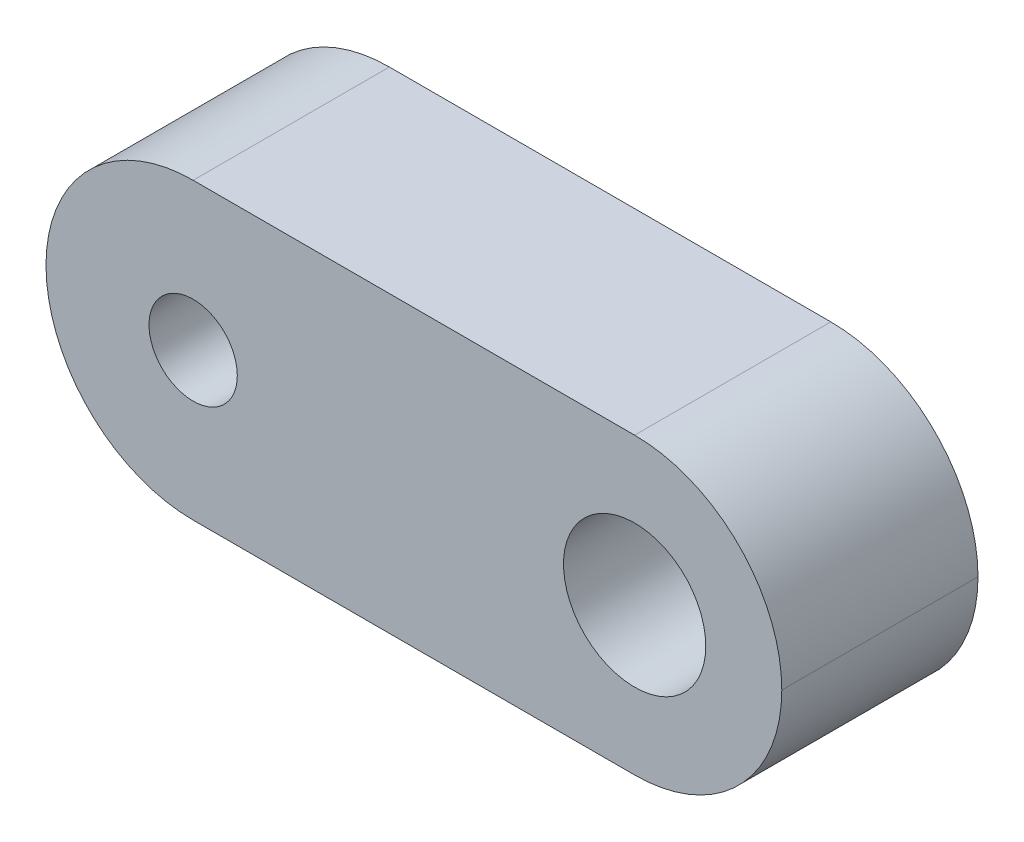
ISO-10303-21;
HEADER;
FILE_DESCRIPTION(('STEP AP214'),'2;1');
FILE_NAME('part.step','',(''),(''),'','','');
FILE_SCHEMA(('AUTOMOTIVE_DESIGN { 1 0 10303 214 1 1 1 1 }'));
ENDSEC;
DATA;
#1=APPLICATION_CONTEXT('core data for automotive mechanical design processes');
#2=APPLICATION_PROTOCOL_DEFINITION('international standard','automotive_design',2000,#1);
#3=PRODUCT_CONTEXT('',#1,'mechanical');
#4=PRODUCT('Part','Part','',(#3));
#5=PRODUCT_RELATED_PRODUCT_CATEGORY('part','',(#4));
#6=PRODUCT_DEFINITION_FORMATION('','',#4);
#7=PRODUCT_DEFINITION_CONTEXT('part definition',#1,'design');
#8=PRODUCT_DEFINITION('design','',#6,#7);
#9=PRODUCT_DEFINITION_SHAPE('','',#8);
#10=(LENGTH_UNIT() NAMED_UNIT(*) SI_UNIT(.MILLI.,.METRE.));
#11=(NAMED_UNIT(*) PLANE_ANGLE_UNIT() SI_UNIT($,.RADIAN.));
#12=(NAMED_UNIT(*) SI_UNIT($,.STERADIAN.) SOLID_ANGLE_UNIT());
#13=UNCERTAINTY_MEASURE_WITH_UNIT(LENGTH_MEASURE(1.E-05),#10,'distance_accuracy_value','');
#14=(GEOMETRIC_REPRESENTATION_CONTEXT(3) GLOBAL_UNCERTAINTY_ASSIGNED_CONTEXT((#13)) GLOBAL_UNIT_ASSIGNED_CONTEXT((#10,
#11,#12)) REPRESENTATION_CONTEXT('',''));
#15=CARTESIAN_POINT('',(0.,0.,0.));
#16=DIRECTION('',(0.,0.,1.));
#17=DIRECTION('',(1.,0.,0.));
#18=AXIS2_PLACEMENT_3D('',#15,#16,#17);
#19=CARTESIAN_POINT('',(0.,-6.,4.));
#20=DIRECTION('',(0.,1.,0.));
#21=DIRECTION('',(0.,0.,1.));
#22=AXIS2_PLACEMENT_3D('',#19,#20,#21);
#23=PLANE('',#22);
#24=DIRECTION('',(1.,0.,0.));
#25=VECTOR('',#24,1.);
#26=CARTESIAN_POINT('',(0.,-6.,0.));
#27=LINE('',#26,#25);
#28=CARTESIAN_POINT('',(3.,-6.,0.));
#29=VERTEX_POINT('',#28);
#30=CARTESIAN_POINT('',(12.,-6.,0.));
#31=VERTEX_POINT('',#30);
#32=EDGE_CURVE('E103',#29,#31,#27,.T.);
#33=ORIENTED_EDGE('',*,*,#32,.T.);
#34=DIRECTION('',(0.,0.,-1.));
#35=VECTOR('',#34,1.);
#36=CARTESIAN_POINT('',(12.,-6.,4.));
#37=LINE('',#36,#35);
#38=CARTESIAN_POINT('',(12.,-6.,4.));
#39=VERTEX_POINT('',#38);
#40=EDGE_CURVE('E135',#31,#39,#37,.F.);
#41=ORIENTED_EDGE('',*,*,#40,.T.);
#42=DIRECTION('',(1.,0.,0.));
#43=VECTOR('',#42,1.);
#44=CARTESIAN_POINT('',(0.,-6.,4.));
#45=LINE('',#44,#43);
#46=CARTESIAN_POINT('',(3.,-6.,4.));
#47=VERTEX_POINT('',#46);
#48=EDGE_CURVE('E145',#47,#39,#45,.T.);
#49=ORIENTED_EDGE('',*,*,#48,.F.);
#50=DIRECTION('',(0.,0.,-1.));
#51=VECTOR('',#50,1.);
#52=CARTESIAN_POINT('',(3.,-6.,4.));
#53=LINE('',#52,#51);
#54=EDGE_CURVE('E138',#47,#29,#53,.T.);
#55=ORIENTED_EDGE('',*,*,#54,.T.);
#56=EDGE_LOOP('',(#33,#41,#49,#55));
#57=FACE_BOUND('',#56,.T.);
#58=ADVANCED_FACE('F44',(#57),#23,.F.);
#59=CARTESIAN_POINT('',(0.,0.,4.));
#60=DIRECTION('',(0.,-1.,0.));
#61=DIRECTION('',(0.,0.,-1.));
#62=AXIS2_PLACEMENT_3D('',#59,#60,#61);
#63=PLANE('',#62);
#64=DIRECTION('',(-1.,0.,0.));
#65=VECTOR('',#64,1.);
#66=CARTESIAN_POINT('',(0.,0.,4.));
#67=LINE('',#66,#65);
#68=CARTESIAN_POINT('',(12.,0.,4.));
#69=VERTEX_POINT('',#68);
#70=CARTESIAN_POINT('',(3.,0.,4.));
#71=VERTEX_POINT('',#70);
#72=EDGE_CURVE('E114',#69,#71,#67,.T.);
#73=ORIENTED_EDGE('',*,*,#72,.F.);
#74=DIRECTION('',(0.,0.,-1.));
#75=VECTOR('',#74,1.);
#76=CARTESIAN_POINT('',(12.,0.,4.));
#77=LINE('',#76,#75);
#78=CARTESIAN_POINT('',(12.,0.,0.));
#79=VERTEX_POINT('',#78);
#80=EDGE_CURVE('E13',#69,#79,#77,.T.);
#81=ORIENTED_EDGE('',*,*,#80,.T.);
#82=DIRECTION('',(-1.,0.,0.));
#83=VECTOR('',#82,1.);
#84=CARTESIAN_POINT('',(0.,0.,0.));
#85=LINE('',#84,#83);
#86=CARTESIAN_POINT('',(3.,0.,0.));
#87=VERTEX_POINT('',#86);
#88=EDGE_CURVE('E143',#79,#87,#85,.T.);
#89=ORIENTED_EDGE('',*,*,#88,.T.);
#90=DIRECTION('',(0.,0.,-1.));
#91=VECTOR('',#90,1.);
#92=CARTESIAN_POINT('',(3.,0.,4.));
#93=LINE('',#92,#91);
#94=EDGE_CURVE('E53',#87,#71,#93,.F.);
#95=ORIENTED_EDGE('',*,*,#94,.T.);
#96=EDGE_LOOP('',(#73,#81,#89,#95));
#97=FACE_BOUND('',#96,.T.);
#98=ADVANCED_FACE('F165',(#97),#63,.F.);
#99=CARTESIAN_POINT('',(0.,0.,4.));
#100=DIRECTION('',(0.,0.,1.));
#101=DIRECTION('',(1.,0.,0.));
#102=AXIS2_PLACEMENT_3D('',#99,#100,#101);
#103=PLANE('',#102);
#104=CARTESIAN_POINT('',(12.,-3.,4.));
#105=DIRECTION('',(0.,0.,1.));
#106=DIRECTION('',(1.,0.,0.));
#107=AXIS2_PLACEMENT_3D('',#104,#105,#106);
#108=CIRCLE('',#107,1.45);
#109=CARTESIAN_POINT('',(13.45,-3.,4.));
#110=VERTEX_POINT('',#109);
#111=EDGE_CURVE('E125',#110,#110,#108,.T.);
#112=ORIENTED_EDGE('',*,*,#111,.F.);
#113=EDGE_LOOP('',(#112));
#114=FACE_BOUND('',#113,.T.);
#115=CARTESIAN_POINT('',(3.,-3.,4.));
#116=DIRECTION('',(0.,0.,1.));
#117=DIRECTION('',(1.,0.,0.));
#118=AXIS2_PLACEMENT_3D('',#115,#116,#117);
#119=CIRCLE('',#118,0.9);
#120=CARTESIAN_POINT('',(3.9,-3.,4.));
#121=VERTEX_POINT('',#120);
#122=EDGE_CURVE('E147',#121,#121,#119,.T.);
#123=ORIENTED_EDGE('',*,*,#122,.F.);
#124=EDGE_LOOP('',(#123));
#125=FACE_BOUND('',#124,.T.);
#126=ORIENTED_EDGE('',*,*,#48,.T.);
#127=CARTESIAN_POINT('',(12.,-3.,4.));
#128=DIRECTION('',(0.,0.,1.));
#129=DIRECTION('',(1.,0.,0.));
#130=AXIS2_PLACEMENT_3D('',#127,#128,#129);
#131=CIRCLE('',#130,3.);
#132=CARTESIAN_POINT('',(15.,-3.,4.));
#133=VERTEX_POINT('',#132);
#134=EDGE_CURVE('E129',#39,#133,#131,.T.);
#135=ORIENTED_EDGE('',*,*,#134,.T.);
#136=CARTESIAN_POINT('',(12.,-3.,4.));
#137=DIRECTION('',(0.,0.,1.));
#138=DIRECTION('',(1.,0.,0.));
#139=AXIS2_PLACEMENT_3D('',#136,#137,#138);
#140=CIRCLE('',#139,3.);
#141=EDGE_CURVE('E67',#133,#69,#140,.T.);
#142=ORIENTED_EDGE('',*,*,#141,.T.);
#143=ORIENTED_EDGE('',*,*,#72,.T.);
#144=CARTESIAN_POINT('',(3.,-3.,4.));
#145=DIRECTION('',(0.,0.,1.));
#146=DIRECTION('',(1.,0.,0.));
#147=AXIS2_PLACEMENT_3D('',#144,#145,#146);
#148=CIRCLE('',#147,3.);
#149=CARTESIAN_POINT('',(0.,-3.,4.));
#150=VERTEX_POINT('',#149);
#151=EDGE_CURVE('E133',#71,#150,#148,.T.);
#152=ORIENTED_EDGE('',*,*,#151,.T.);
#153=CARTESIAN_POINT('',(3.,-3.,4.));
#154=DIRECTION('',(0.,0.,1.));
#155=DIRECTION('',(1.,0.,0.));
#156=AXIS2_PLACEMENT_3D('',#153,#154,#155);
#157=CIRCLE('',#156,3.);
#158=EDGE_CURVE('E117',#150,#47,#157,.T.);
#159=ORIENTED_EDGE('',*,*,#158,.T.);
#160=EDGE_LOOP('',(#126,#135,#142,#143,#152,#159));
#161=FACE_BOUND('',#160,.T.);
#162=ADVANCED_FACE('F162',(#114,#125,#161),#103,.T.);
#163=CARTESIAN_POINT('',(0.,0.,0.));
#164=DIRECTION('',(0.,0.,1.));
#165=DIRECTION('',(1.,0.,0.));
#166=AXIS2_PLACEMENT_3D('',#163,#164,#165);
#167=PLANE('',#166);
#168=CARTESIAN_POINT('',(12.,-3.,0.));
#169=DIRECTION('',(0.,0.,1.));
#170=DIRECTION('',(1.,0.,0.));
#171=AXIS2_PLACEMENT_3D('',#168,#169,#170);
#172=CIRCLE('',#171,1.45);
#173=CARTESIAN_POINT('',(13.45,-3.,0.));
#174=VERTEX_POINT('',#173);
#175=EDGE_CURVE('E120',#174,#174,#172,.T.);
#176=ORIENTED_EDGE('',*,*,#175,.T.);
#177=EDGE_LOOP('',(#176));
#178=FACE_BOUND('',#177,.T.);
#179=CARTESIAN_POINT('',(3.,-3.,0.));
#180=DIRECTION('',(0.,0.,1.));
#181=DIRECTION('',(1.,0.,0.));
#182=AXIS2_PLACEMENT_3D('',#179,#180,#181);
#183=CIRCLE('',#182,0.9);
#184=CARTESIAN_POINT('',(3.9,-3.,0.));
#185=VERTEX_POINT('',#184);
#186=EDGE_CURVE('E153',#185,#185,#183,.T.);
#187=ORIENTED_EDGE('',*,*,#186,.T.);
#188=EDGE_LOOP('',(#187));
#189=FACE_BOUND('',#188,.T.);
#190=CARTESIAN_POINT('',(12.,-3.,0.));
#191=DIRECTION('',(0.,0.,1.));
#192=DIRECTION('',(1.,0.,0.));
#193=AXIS2_PLACEMENT_3D('',#190,#191,#192);
#194=CIRCLE('',#193,3.);
#195=CARTESIAN_POINT('',(15.,-3.,0.));
#196=VERTEX_POINT('',#195);
#197=EDGE_CURVE('E108',#79,#196,#194,.F.);
#198=ORIENTED_EDGE('',*,*,#197,.T.);
#199=CARTESIAN_POINT('',(12.,-3.,0.));
#200=DIRECTION('',(0.,0.,1.));
#201=DIRECTION('',(1.,0.,0.));
#202=AXIS2_PLACEMENT_3D('',#199,#200,#201);
#203=CIRCLE('',#202,3.);
#204=EDGE_CURVE('E140',#196,#31,#203,.F.);
#205=ORIENTED_EDGE('',*,*,#204,.T.);
#206=ORIENTED_EDGE('',*,*,#32,.F.);
#207=CARTESIAN_POINT('',(3.,-3.,0.));
#208=DIRECTION('',(0.,0.,1.));
#209=DIRECTION('',(1.,0.,0.));
#210=AXIS2_PLACEMENT_3D('',#207,#208,#209);
#211=CIRCLE('',#210,3.);
#212=CARTESIAN_POINT('',(0.,-3.,0.));
#213=VERTEX_POINT('',#212);
#214=EDGE_CURVE('E97',#29,#213,#211,.F.);
#215=ORIENTED_EDGE('',*,*,#214,.T.);
#216=CARTESIAN_POINT('',(3.,-3.,0.));
#217=DIRECTION('',(0.,0.,1.));
#218=DIRECTION('',(1.,0.,0.));
#219=AXIS2_PLACEMENT_3D('',#216,#217,#218);
#220=CIRCLE('',#219,3.);
#221=EDGE_CURVE('E101',#213,#87,#220,.F.);
#222=ORIENTED_EDGE('',*,*,#221,.T.);
#223=ORIENTED_EDGE('',*,*,#88,.F.);
#224=EDGE_LOOP('',(#198,#205,#206,#215,#222,#223));
#225=FACE_BOUND('',#224,.T.);
#226=ADVANCED_FACE('F99',(#178,#189,#225),#167,.F.);
#227=CARTESIAN_POINT('',(3.,-3.,0.));
#228=DIRECTION('',(0.,0.,1.));
#229=DIRECTION('',(1.,0.,0.));
#230=AXIS2_PLACEMENT_3D('',#227,#228,#229);
#231=CYLINDRICAL_SURFACE('',#230,0.9);
#232=ORIENTED_EDGE('',*,*,#122,.T.);
#233=EDGE_LOOP('',(#232));
#234=FACE_BOUND('',#233,.T.);
#235=ORIENTED_EDGE('',*,*,#186,.F.);
#236=EDGE_LOOP('',(#235));
#237=FACE_BOUND('',#236,.T.);
#238=ADVANCED_FACE('F208',(#234,#237),#231,.F.);
#239=CARTESIAN_POINT('',(12.,-3.,0.));
#240=DIRECTION('',(0.,0.,1.));
#241=DIRECTION('',(1.,0.,0.));
#242=AXIS2_PLACEMENT_3D('',#239,#240,#241);
#243=CYLINDRICAL_SURFACE('',#242,1.45);
#244=ORIENTED_EDGE('',*,*,#111,.T.);
#245=EDGE_LOOP('',(#244));
#246=FACE_BOUND('',#245,.T.);
#247=ORIENTED_EDGE('',*,*,#175,.F.);
#248=EDGE_LOOP('',(#247));
#249=FACE_BOUND('',#248,.T.);
#250=ADVANCED_FACE('F159',(#246,#249),#243,.F.);
#251=CARTESIAN_POINT('',(12.,-3.,4.));
#252=DIRECTION('',(0.,0.,-1.));
#253=DIRECTION('',(-1.,0.,0.));
#254=AXIS2_PLACEMENT_3D('',#251,#252,#253);
#255=CYLINDRICAL_SURFACE('',#254,3.);
#256=ORIENTED_EDGE('',*,*,#80,.F.);
#257=ORIENTED_EDGE('',*,*,#141,.F.);
#258=DIRECTION('',(0.,0.,-1.));
#259=VECTOR('',#258,1.);
#260=CARTESIAN_POINT('',(15.,-3.,4.));
#261=LINE('',#260,#259);
#262=EDGE_CURVE('E118',#196,#133,#261,.F.);
#263=ORIENTED_EDGE('',*,*,#262,.F.);
#264=ORIENTED_EDGE('',*,*,#197,.F.);
#265=EDGE_LOOP('',(#256,#257,#263,#264));
#266=FACE_BOUND('',#265,.T.);
#267=ADVANCED_FACE('F175',(#266),#255,.T.);
#268=CARTESIAN_POINT('',(12.,-3.,4.));
#269=DIRECTION('',(0.,0.,-1.));
#270=DIRECTION('',(-1.,0.,0.));
#271=AXIS2_PLACEMENT_3D('',#268,#269,#270);
#272=CYLINDRICAL_SURFACE('',#271,3.);
#273=ORIENTED_EDGE('',*,*,#134,.F.);
#274=ORIENTED_EDGE('',*,*,#40,.F.);
#275=ORIENTED_EDGE('',*,*,#204,.F.);
#276=ORIENTED_EDGE('',*,*,#262,.T.);
#277=EDGE_LOOP('',(#273,#274,#275,#276));
#278=FACE_BOUND('',#277,.T.);
#279=ADVANCED_FACE('F171',(#278),#272,.T.);
#280=CARTESIAN_POINT('',(3.,-3.,4.));
#281=DIRECTION('',(0.,0.,-1.));
#282=DIRECTION('',(-1.,0.,0.));
#283=AXIS2_PLACEMENT_3D('',#280,#281,#282);
#284=CYLINDRICAL_SURFACE('',#283,3.);
#285=DIRECTION('',(0.,0.,-1.));
#286=VECTOR('',#285,1.);
#287=CARTESIAN_POINT('',(0.,-3.,4.));
#288=LINE('',#287,#286);
#289=EDGE_CURVE('E48',#150,#213,#288,.T.);
#290=ORIENTED_EDGE('',*,*,#289,.F.);
#291=ORIENTED_EDGE('',*,*,#151,.F.);
#292=ORIENTED_EDGE('',*,*,#94,.F.);
#293=ORIENTED_EDGE('',*,*,#221,.F.);
#294=EDGE_LOOP('',(#290,#291,#292,#293));
#295=FACE_BOUND('',#294,.T.);
#296=ADVANCED_FACE('F46',(#295),#284,.T.);
#297=CARTESIAN_POINT('',(3.,-3.,4.));
#298=DIRECTION('',(0.,0.,-1.));
#299=DIRECTION('',(-1.,0.,0.));
#300=AXIS2_PLACEMENT_3D('',#297,#298,#299);
#301=CYLINDRICAL_SURFACE('',#300,3.);
#302=ORIENTED_EDGE('',*,*,#158,.F.);
#303=ORIENTED_EDGE('',*,*,#289,.T.);
#304=ORIENTED_EDGE('',*,*,#214,.F.);
#305=ORIENTED_EDGE('',*,*,#54,.F.);
#306=EDGE_LOOP('',(#302,#303,#304,#305));
#307=FACE_BOUND('',#306,.T.);
#308=ADVANCED_FACE('F116',(#307),#301,.T.);
#309=CLOSED_SHELL('',(#58,#98,#162,#226,#238,#250,#267,#279,#296,#308));
#310=MANIFOLD_SOLID_BREP('B2',#309);
#311=ADVANCED_BREP_SHAPE_REPRESENTATION('',(#18,#310),#14);
#312=SHAPE_DEFINITION_REPRESENTATION(#9,#311);
ENDSEC;
END-ISO-10303-21;
